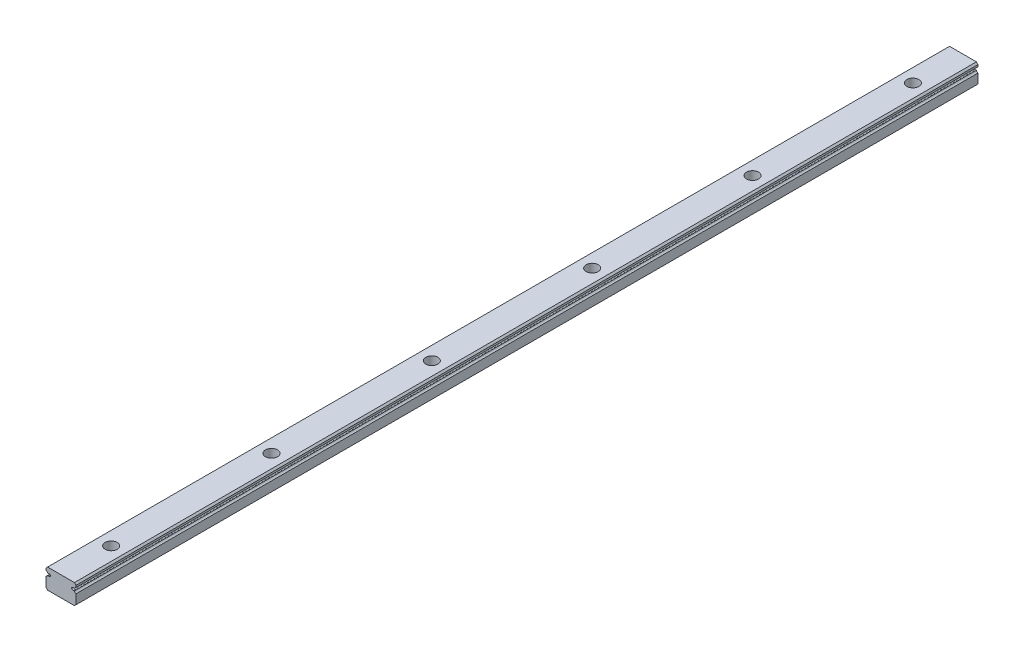
ISO-10303-21;
HEADER;
FILE_DESCRIPTION(('STEP AP214'),'2;1');
FILE_NAME('part.step','',(''),(''),'','','');
FILE_SCHEMA(('AUTOMOTIVE_DESIGN { 1 0 10303 214 1 1 1 1 }'));
ENDSEC;
DATA;
#1=APPLICATION_CONTEXT('core data for automotive mechanical design processes');
#2=APPLICATION_PROTOCOL_DEFINITION('international standard','automotive_design',2000,#1);
#3=PRODUCT_CONTEXT('',#1,'mechanical');
#4=PRODUCT('Part','Part','',(#3));
#5=PRODUCT_RELATED_PRODUCT_CATEGORY('part','',(#4));
#6=PRODUCT_DEFINITION_FORMATION('','',#4);
#7=PRODUCT_DEFINITION_CONTEXT('part definition',#1,'design');
#8=PRODUCT_DEFINITION('design','',#6,#7);
#9=PRODUCT_DEFINITION_SHAPE('','',#8);
#10=(LENGTH_UNIT() NAMED_UNIT(*) SI_UNIT(.MILLI.,.METRE.));
#11=(NAMED_UNIT(*) PLANE_ANGLE_UNIT() SI_UNIT($,.RADIAN.));
#12=(NAMED_UNIT(*) SI_UNIT($,.STERADIAN.) SOLID_ANGLE_UNIT());
#13=UNCERTAINTY_MEASURE_WITH_UNIT(LENGTH_MEASURE(1.E-05),#10,'distance_accuracy_value','');
#14=(GEOMETRIC_REPRESENTATION_CONTEXT(3) GLOBAL_UNCERTAINTY_ASSIGNED_CONTEXT((#13)) GLOBAL_UNIT_ASSIGNED_CONTEXT((#10,
#11,#12)) REPRESENTATION_CONTEXT('',''));
#15=CARTESIAN_POINT('',(0.,0.,0.));
#16=DIRECTION('',(0.,0.,1.));
#17=DIRECTION('',(1.,0.,0.));
#18=AXIS2_PLACEMENT_3D('',#15,#16,#17);
#19=CARTESIAN_POINT('',(0.,2.44399999999999,-450.));
#20=DIRECTION('',(0.,1.,0.));
#21=DIRECTION('',(-1.,0.,0.));
#22=AXIS2_PLACEMENT_3D('',#19,#20,#21);
#23=PLANE('',#22);
#24=DIRECTION('',(-1.,0.,0.));
#25=VECTOR('',#24,1.);
#26=CARTESIAN_POINT('',(0.,2.44399999999999,0.));
#27=LINE('',#26,#25);
#28=CARTESIAN_POINT('',(6.62453106662687,2.444,0.));
#29=VERTEX_POINT('',#28);
#30=CARTESIAN_POINT('',(6.13979157616564,2.444,0.));
#31=VERTEX_POINT('',#30);
#32=EDGE_CURVE('E214',#29,#31,#27,.T.);
#33=ORIENTED_EDGE('',*,*,#32,.T.);
#34=DIRECTION('',(0.,0.,1.));
#35=VECTOR('',#34,1.);
#36=CARTESIAN_POINT('',(6.13979157616564,2.444,-450.));
#37=LINE('',#36,#35);
#38=CARTESIAN_POINT('',(6.13979157616564,2.444,-450.));
#39=VERTEX_POINT('',#38);
#40=EDGE_CURVE('E11',#39,#31,#37,.T.);
#41=ORIENTED_EDGE('',*,*,#40,.F.);
#42=DIRECTION('',(-1.,0.,0.));
#43=VECTOR('',#42,1.);
#44=CARTESIAN_POINT('',(0.,2.44399999999999,-450.));
#45=LINE('',#44,#43);
#46=CARTESIAN_POINT('',(6.62453106662687,2.444,-450.));
#47=VERTEX_POINT('',#46);
#48=EDGE_CURVE('E63',#47,#39,#45,.T.);
#49=ORIENTED_EDGE('',*,*,#48,.F.);
#50=DIRECTION('',(0.,0.,1.));
#51=VECTOR('',#50,1.);
#52=CARTESIAN_POINT('',(6.62453106662687,2.444,-450.));
#53=LINE('',#52,#51);
#54=EDGE_CURVE('E48',#47,#29,#53,.T.);
#55=ORIENTED_EDGE('',*,*,#54,.T.);
#56=EDGE_LOOP('',(#33,#41,#49,#55));
#57=FACE_BOUND('',#56,.T.);
#58=ADVANCED_FACE('F45',(#57),#23,.F.);
#59=CARTESIAN_POINT('',(5.9,1.894,-450.));
#60=DIRECTION('',(0.,0.,1.));
#61=DIRECTION('',(1.,0.,0.));
#62=AXIS2_PLACEMENT_3D('',#59,#60,#61);
#63=CYLINDRICAL_SURFACE('',#62,0.6);
#64=CARTESIAN_POINT('',(5.9,1.894,0.));
#65=DIRECTION('',(0.,0.,1.));
#66=DIRECTION('',(1.,0.,0.));
#67=AXIS2_PLACEMENT_3D('',#64,#65,#66);
#68=CIRCLE('',#67,0.6);
#69=CARTESIAN_POINT('',(6.13979157616564,1.344,0.));
#70=VERTEX_POINT('',#69);
#71=EDGE_CURVE('E260',#70,#31,#68,.F.);
#72=ORIENTED_EDGE('',*,*,#71,.F.);
#73=DIRECTION('',(0.,0.,1.));
#74=VECTOR('',#73,1.);
#75=CARTESIAN_POINT('',(6.13979157616564,1.344,-450.));
#76=LINE('',#75,#74);
#77=CARTESIAN_POINT('',(6.13979157616564,1.344,-450.));
#78=VERTEX_POINT('',#77);
#79=EDGE_CURVE('E54',#78,#70,#76,.T.);
#80=ORIENTED_EDGE('',*,*,#79,.F.);
#81=CARTESIAN_POINT('',(5.9,1.894,-450.));
#82=DIRECTION('',(0.,0.,1.));
#83=DIRECTION('',(1.,0.,0.));
#84=AXIS2_PLACEMENT_3D('',#81,#82,#83);
#85=CIRCLE('',#84,0.6);
#86=EDGE_CURVE('E204',#78,#39,#85,.F.);
#87=ORIENTED_EDGE('',*,*,#86,.T.);
#88=ORIENTED_EDGE('',*,*,#40,.T.);
#89=EDGE_LOOP('',(#72,#80,#87,#88));
#90=FACE_BOUND('',#89,.T.);
#91=ADVANCED_FACE('F318',(#90),#63,.F.);
#92=CARTESIAN_POINT('',(0.,1.34399999999999,-450.));
#93=DIRECTION('',(0.,1.,0.));
#94=DIRECTION('',(-1.,0.,0.));
#95=AXIS2_PLACEMENT_3D('',#92,#93,#94);
#96=PLANE('',#95);
#97=DIRECTION('',(-1.,0.,0.));
#98=VECTOR('',#97,1.);
#99=CARTESIAN_POINT('',(0.,1.34399999999999,0.));
#100=LINE('',#99,#98);
#101=CARTESIAN_POINT('',(6.62453106662687,1.344,0.));
#102=VERTEX_POINT('',#101);
#103=EDGE_CURVE('E192',#102,#70,#100,.T.);
#104=ORIENTED_EDGE('',*,*,#103,.F.);
#105=DIRECTION('',(0.,0.,1.));
#106=VECTOR('',#105,1.);
#107=CARTESIAN_POINT('',(6.62453106662687,1.344,-450.));
#108=LINE('',#107,#106);
#109=CARTESIAN_POINT('',(6.62453106662687,1.344,-450.));
#110=VERTEX_POINT('',#109);
#111=EDGE_CURVE('E188',#110,#102,#108,.T.);
#112=ORIENTED_EDGE('',*,*,#111,.F.);
#113=DIRECTION('',(-1.,0.,0.));
#114=VECTOR('',#113,1.);
#115=CARTESIAN_POINT('',(0.,1.34399999999999,-450.));
#116=LINE('',#115,#114);
#117=EDGE_CURVE('E191',#110,#78,#116,.T.);
#118=ORIENTED_EDGE('',*,*,#117,.T.);
#119=ORIENTED_EDGE('',*,*,#79,.T.);
#120=EDGE_LOOP('',(#104,#112,#118,#119));
#121=FACE_BOUND('',#120,.T.);
#122=ADVANCED_FACE('F190',(#121),#96,.T.);
#123=CARTESIAN_POINT('',(7.9,1.894,-450.));
#124=DIRECTION('',(0.,0.,1.));
#125=DIRECTION('',(1.,0.,0.));
#126=AXIS2_PLACEMENT_3D('',#123,#124,#125);
#127=CYLINDRICAL_SURFACE('',#126,1.389);
#128=CARTESIAN_POINT('',(7.9,1.894,0.));
#129=DIRECTION('',(0.,0.,1.));
#130=DIRECTION('',(1.,0.,0.));
#131=AXIS2_PLACEMENT_3D('',#128,#129,#130);
#132=CIRCLE('',#131,1.389);
#133=CARTESIAN_POINT('',(7.5,0.563841738739334,0.));
#134=VERTEX_POINT('',#133);
#135=EDGE_CURVE('E257',#134,#102,#132,.F.);
#136=ORIENTED_EDGE('',*,*,#135,.F.);
#137=DIRECTION('',(0.,0.,1.));
#138=VECTOR('',#137,1.);
#139=CARTESIAN_POINT('',(7.5,0.563841738739334,-450.));
#140=LINE('',#139,#138);
#141=CARTESIAN_POINT('',(7.5,0.563841738739334,-450.));
#142=VERTEX_POINT('',#141);
#143=EDGE_CURVE('E197',#142,#134,#140,.T.);
#144=ORIENTED_EDGE('',*,*,#143,.F.);
#145=CARTESIAN_POINT('',(7.9,1.894,-450.));
#146=DIRECTION('',(0.,0.,1.));
#147=DIRECTION('',(1.,0.,0.));
#148=AXIS2_PLACEMENT_3D('',#145,#146,#147);
#149=CIRCLE('',#148,1.389);
#150=EDGE_CURVE('E202',#142,#110,#149,.F.);
#151=ORIENTED_EDGE('',*,*,#150,.T.);
#152=ORIENTED_EDGE('',*,*,#111,.T.);
#153=EDGE_LOOP('',(#136,#144,#151,#152));
#154=FACE_BOUND('',#153,.T.);
#155=ADVANCED_FACE('F206',(#154),#127,.F.);
#156=CARTESIAN_POINT('',(7.5,0.,-450.));
#157=DIRECTION('',(1.,0.,0.));
#158=DIRECTION('',(0.,0.,-1.));
#159=AXIS2_PLACEMENT_3D('',#156,#157,#158);
#160=PLANE('',#159);
#161=DIRECTION('',(0.,1.,0.));
#162=VECTOR('',#161,1.);
#163=CARTESIAN_POINT('',(7.5,0.,0.));
#164=LINE('',#163,#162);
#165=CARTESIAN_POINT('',(7.5,-4.2,0.));
#166=VERTEX_POINT('',#165);
#167=EDGE_CURVE('E254',#166,#134,#164,.T.);
#168=ORIENTED_EDGE('',*,*,#167,.F.);
#169=DIRECTION('',(0.,0.,1.));
#170=VECTOR('',#169,1.);
#171=CARTESIAN_POINT('',(7.5,-4.2,-450.));
#172=LINE('',#171,#170);
#173=CARTESIAN_POINT('',(7.5,-4.2,-450.));
#174=VERTEX_POINT('',#173);
#175=EDGE_CURVE('E265',#174,#166,#172,.T.);
#176=ORIENTED_EDGE('',*,*,#175,.F.);
#177=DIRECTION('',(0.,1.,0.));
#178=VECTOR('',#177,1.);
#179=CARTESIAN_POINT('',(7.5,0.,-450.));
#180=LINE('',#179,#178);
#181=EDGE_CURVE('E207',#174,#142,#180,.T.);
#182=ORIENTED_EDGE('',*,*,#181,.T.);
#183=ORIENTED_EDGE('',*,*,#143,.T.);
#184=EDGE_LOOP('',(#168,#176,#182,#183));
#185=FACE_BOUND('',#184,.T.);
#186=ADVANCED_FACE('F331',(#185),#160,.T.);
#187=CARTESIAN_POINT('',(5.85,-5.85,-450.));
#188=DIRECTION('',(0.707106781186547,-0.707106781186547,0.));
#189=DIRECTION('',(0.707106781186548,0.707106781186548,0.));
#190=AXIS2_PLACEMENT_3D('',#187,#188,#189);
#191=PLANE('',#190);
#192=DIRECTION('',(0.707106781186548,0.707106781186548,0.));
#193=VECTOR('',#192,1.);
#194=CARTESIAN_POINT('',(5.85,-5.85,0.));
#195=LINE('',#194,#193);
#196=CARTESIAN_POINT('',(6.7,-5.,0.));
#197=VERTEX_POINT('',#196);
#198=EDGE_CURVE('E251',#197,#166,#195,.T.);
#199=ORIENTED_EDGE('',*,*,#198,.F.);
#200=DIRECTION('',(0.,0.,1.));
#201=VECTOR('',#200,1.);
#202=CARTESIAN_POINT('',(6.7,-5.,-450.));
#203=LINE('',#202,#201);
#204=CARTESIAN_POINT('',(6.7,-5.,-450.));
#205=VERTEX_POINT('',#204);
#206=EDGE_CURVE('E267',#205,#197,#203,.T.);
#207=ORIENTED_EDGE('',*,*,#206,.F.);
#208=DIRECTION('',(0.707106781186548,0.707106781186548,0.));
#209=VECTOR('',#208,1.);
#210=CARTESIAN_POINT('',(5.85,-5.85,-450.));
#211=LINE('',#210,#209);
#212=EDGE_CURVE('E209',#205,#174,#211,.T.);
#213=ORIENTED_EDGE('',*,*,#212,.T.);
#214=ORIENTED_EDGE('',*,*,#175,.T.);
#215=EDGE_LOOP('',(#199,#207,#213,#214));
#216=FACE_BOUND('',#215,.T.);
#217=ADVANCED_FACE('F334',(#216),#191,.T.);
#218=CARTESIAN_POINT('',(0.,-5.,-450.));
#219=DIRECTION('',(0.,1.,0.));
#220=DIRECTION('',(0.,0.,1.));
#221=AXIS2_PLACEMENT_3D('',#218,#219,#220);
#222=PLANE('',#221);
#223=CARTESIAN_POINT('',(0.,-5.,-425.));
#224=DIRECTION('',(0.,1.,0.));
#225=DIRECTION('',(0.,0.,1.));
#226=AXIS2_PLACEMENT_3D('',#223,#224,#225);
#227=CIRCLE('',#226,1.75);
#228=CARTESIAN_POINT('',(0.,-5.,-423.25));
#229=VERTEX_POINT('',#228);
#230=EDGE_CURVE('E529',#229,#229,#227,.T.);
#231=ORIENTED_EDGE('',*,*,#230,.T.);
#232=EDGE_LOOP('',(#231));
#233=FACE_BOUND('',#232,.T.);
#234=CARTESIAN_POINT('',(0.,-5.,-345.));
#235=DIRECTION('',(0.,1.,0.));
#236=DIRECTION('',(0.,0.,1.));
#237=AXIS2_PLACEMENT_3D('',#234,#235,#236);
#238=CIRCLE('',#237,1.75);
#239=CARTESIAN_POINT('',(0.,-5.,-343.25));
#240=VERTEX_POINT('',#239);
#241=EDGE_CURVE('E517',#240,#240,#238,.T.);
#242=ORIENTED_EDGE('',*,*,#241,.T.);
#243=EDGE_LOOP('',(#242));
#244=FACE_BOUND('',#243,.T.);
#245=CARTESIAN_POINT('',(0.,-5.,-265.));
#246=DIRECTION('',(0.,1.,0.));
#247=DIRECTION('',(0.,0.,1.));
#248=AXIS2_PLACEMENT_3D('',#245,#246,#247);
#249=CIRCLE('',#248,1.75);
#250=CARTESIAN_POINT('',(0.,-5.,-263.25));
#251=VERTEX_POINT('',#250);
#252=EDGE_CURVE('E505',#251,#251,#249,.T.);
#253=ORIENTED_EDGE('',*,*,#252,.T.);
#254=EDGE_LOOP('',(#253));
#255=FACE_BOUND('',#254,.T.);
#256=CARTESIAN_POINT('',(0.,-5.,-185.));
#257=DIRECTION('',(0.,1.,0.));
#258=DIRECTION('',(0.,0.,1.));
#259=AXIS2_PLACEMENT_3D('',#256,#257,#258);
#260=CIRCLE('',#259,1.75);
#261=CARTESIAN_POINT('',(0.,-5.,-183.25));
#262=VERTEX_POINT('',#261);
#263=EDGE_CURVE('E493',#262,#262,#260,.T.);
#264=ORIENTED_EDGE('',*,*,#263,.T.);
#265=EDGE_LOOP('',(#264));
#266=FACE_BOUND('',#265,.T.);
#267=CARTESIAN_POINT('',(0.,-5.,-105.));
#268=DIRECTION('',(0.,1.,0.));
#269=DIRECTION('',(0.,0.,1.));
#270=AXIS2_PLACEMENT_3D('',#267,#268,#269);
#271=CIRCLE('',#270,1.75);
#272=CARTESIAN_POINT('',(0.,-5.,-103.25));
#273=VERTEX_POINT('',#272);
#274=EDGE_CURVE('E481',#273,#273,#271,.T.);
#275=ORIENTED_EDGE('',*,*,#274,.T.);
#276=EDGE_LOOP('',(#275));
#277=FACE_BOUND('',#276,.T.);
#278=CARTESIAN_POINT('',(0.,-5.,-25.));
#279=DIRECTION('',(0.,1.,0.));
#280=DIRECTION('',(0.,0.,1.));
#281=AXIS2_PLACEMENT_3D('',#278,#279,#280);
#282=CIRCLE('',#281,1.75);
#283=CARTESIAN_POINT('',(0.,-5.,-23.25));
#284=VERTEX_POINT('',#283);
#285=EDGE_CURVE('E464',#284,#284,#282,.T.);
#286=ORIENTED_EDGE('',*,*,#285,.T.);
#287=EDGE_LOOP('',(#286));
#288=FACE_BOUND('',#287,.T.);
#289=DIRECTION('',(-1.,0.,0.));
#290=VECTOR('',#289,1.);
#291=CARTESIAN_POINT('',(0.,-5.,0.));
#292=LINE('',#291,#290);
#293=CARTESIAN_POINT('',(-6.7,-5.,0.));
#294=VERTEX_POINT('',#293);
#295=EDGE_CURVE('E249',#197,#294,#292,.T.);
#296=ORIENTED_EDGE('',*,*,#295,.T.);
#297=DIRECTION('',(0.,0.,1.));
#298=VECTOR('',#297,1.);
#299=CARTESIAN_POINT('',(-6.7,-5.,-450.));
#300=LINE('',#299,#298);
#301=CARTESIAN_POINT('',(-6.7,-5.,-450.));
#302=VERTEX_POINT('',#301);
#303=EDGE_CURVE('E269',#302,#294,#300,.T.);
#304=ORIENTED_EDGE('',*,*,#303,.F.);
#305=DIRECTION('',(-1.,0.,0.));
#306=VECTOR('',#305,1.);
#307=CARTESIAN_POINT('',(0.,-5.,-450.));
#308=LINE('',#307,#306);
#309=EDGE_CURVE('E423',#205,#302,#308,.T.);
#310=ORIENTED_EDGE('',*,*,#309,.F.);
#311=ORIENTED_EDGE('',*,*,#206,.T.);
#312=EDGE_LOOP('',(#296,#304,#310,#311));
#313=FACE_BOUND('',#312,.T.);
#314=ADVANCED_FACE('F338',(#233,#244,#255,#266,#277,#288,#313),#222,.F.);
#315=CARTESIAN_POINT('',(-5.85,-5.85,-450.));
#316=DIRECTION('',(0.707106781186547,0.707106781186547,0.));
#317=DIRECTION('',(-0.707106781186548,0.707106781186548,0.));
#318=AXIS2_PLACEMENT_3D('',#315,#316,#317);
#319=PLANE('',#318);
#320=DIRECTION('',(-0.707106781186548,0.707106781186548,0.));
#321=VECTOR('',#320,1.);
#322=CARTESIAN_POINT('',(-5.85,-5.85,0.));
#323=LINE('',#322,#321);
#324=CARTESIAN_POINT('',(-7.5,-4.2,0.));
#325=VERTEX_POINT('',#324);
#326=EDGE_CURVE('E247',#294,#325,#323,.T.);
#327=ORIENTED_EDGE('',*,*,#326,.T.);
#328=DIRECTION('',(0.,0.,1.));
#329=VECTOR('',#328,1.);
#330=CARTESIAN_POINT('',(-7.5,-4.2,-450.));
#331=LINE('',#330,#329);
#332=CARTESIAN_POINT('',(-7.5,-4.2,-450.));
#333=VERTEX_POINT('',#332);
#334=EDGE_CURVE('E272',#333,#325,#331,.T.);
#335=ORIENTED_EDGE('',*,*,#334,.F.);
#336=DIRECTION('',(-0.707106781186548,0.707106781186548,0.));
#337=VECTOR('',#336,1.);
#338=CARTESIAN_POINT('',(-5.85,-5.85,-450.));
#339=LINE('',#338,#337);
#340=EDGE_CURVE('E421',#302,#333,#339,.T.);
#341=ORIENTED_EDGE('',*,*,#340,.F.);
#342=ORIENTED_EDGE('',*,*,#303,.T.);
#343=EDGE_LOOP('',(#327,#335,#341,#342));
#344=FACE_BOUND('',#343,.T.);
#345=ADVANCED_FACE('F342',(#344),#319,.F.);
#346=CARTESIAN_POINT('',(-7.5,0.,-450.));
#347=DIRECTION('',(1.,0.,0.));
#348=DIRECTION('',(0.,1.,0.));
#349=AXIS2_PLACEMENT_3D('',#346,#347,#348);
#350=PLANE('',#349);
#351=DIRECTION('',(0.,1.,0.));
#352=VECTOR('',#351,1.);
#353=CARTESIAN_POINT('',(-7.5,0.,0.));
#354=LINE('',#353,#352);
#355=CARTESIAN_POINT('',(-7.5,0.563841738739332,0.));
#356=VERTEX_POINT('',#355);
#357=EDGE_CURVE('E245',#325,#356,#354,.T.);
#358=ORIENTED_EDGE('',*,*,#357,.T.);
#359=DIRECTION('',(0.,0.,1.));
#360=VECTOR('',#359,1.);
#361=CARTESIAN_POINT('',(-7.5,0.563841738739332,-450.));
#362=LINE('',#361,#360);
#363=CARTESIAN_POINT('',(-7.5,0.563841738739332,-450.));
#364=VERTEX_POINT('',#363);
#365=EDGE_CURVE('E275',#364,#356,#362,.T.);
#366=ORIENTED_EDGE('',*,*,#365,.F.);
#367=DIRECTION('',(0.,1.,0.));
#368=VECTOR('',#367,1.);
#369=CARTESIAN_POINT('',(-7.5,0.,-450.));
#370=LINE('',#369,#368);
#371=EDGE_CURVE('E419',#333,#364,#370,.T.);
#372=ORIENTED_EDGE('',*,*,#371,.F.);
#373=ORIENTED_EDGE('',*,*,#334,.T.);
#374=EDGE_LOOP('',(#358,#366,#372,#373));
#375=FACE_BOUND('',#374,.T.);
#376=ADVANCED_FACE('F346',(#375),#350,.F.);
#377=CARTESIAN_POINT('',(-7.9,1.894,-450.));
#378=DIRECTION('',(0.,0.,1.));
#379=DIRECTION('',(1.,0.,0.));
#380=AXIS2_PLACEMENT_3D('',#377,#378,#379);
#381=CYLINDRICAL_SURFACE('',#380,1.389);
#382=CARTESIAN_POINT('',(-7.9,1.894,0.));
#383=DIRECTION('',(0.,0.,1.));
#384=DIRECTION('',(1.,0.,0.));
#385=AXIS2_PLACEMENT_3D('',#382,#383,#384);
#386=CIRCLE('',#385,1.389);
#387=CARTESIAN_POINT('',(-6.62453106662687,1.344,0.));
#388=VERTEX_POINT('',#387);
#389=EDGE_CURVE('E243',#356,#388,#386,.T.);
#390=ORIENTED_EDGE('',*,*,#389,.T.);
#391=DIRECTION('',(0.,0.,1.));
#392=VECTOR('',#391,1.);
#393=CARTESIAN_POINT('',(-6.62453106662687,1.344,-450.));
#394=LINE('',#393,#392);
#395=CARTESIAN_POINT('',(-6.62453106662687,1.344,-450.));
#396=VERTEX_POINT('',#395);
#397=EDGE_CURVE('E278',#396,#388,#394,.T.);
#398=ORIENTED_EDGE('',*,*,#397,.F.);
#399=CARTESIAN_POINT('',(-7.9,1.894,-450.));
#400=DIRECTION('',(0.,0.,1.));
#401=DIRECTION('',(1.,0.,0.));
#402=AXIS2_PLACEMENT_3D('',#399,#400,#401);
#403=CIRCLE('',#402,1.389);
#404=EDGE_CURVE('E417',#364,#396,#403,.T.);
#405=ORIENTED_EDGE('',*,*,#404,.F.);
#406=ORIENTED_EDGE('',*,*,#365,.T.);
#407=EDGE_LOOP('',(#390,#398,#405,#406));
#408=FACE_BOUND('',#407,.T.);
#409=ADVANCED_FACE('F350',(#408),#381,.F.);
#410=CARTESIAN_POINT('',(0.,1.34400000000001,-450.));
#411=DIRECTION('',(0.,-1.,0.));
#412=DIRECTION('',(1.,0.,0.));
#413=AXIS2_PLACEMENT_3D('',#410,#411,#412);
#414=PLANE('',#413);
#415=DIRECTION('',(1.,0.,0.));
#416=VECTOR('',#415,1.);
#417=CARTESIAN_POINT('',(0.,1.34400000000001,0.));
#418=LINE('',#417,#416);
#419=CARTESIAN_POINT('',(-6.13979157616564,1.344,0.));
#420=VERTEX_POINT('',#419);
#421=EDGE_CURVE('E241',#388,#420,#418,.T.);
#422=ORIENTED_EDGE('',*,*,#421,.T.);
#423=DIRECTION('',(0.,0.,1.));
#424=VECTOR('',#423,1.);
#425=CARTESIAN_POINT('',(-6.13979157616564,1.344,-450.));
#426=LINE('',#425,#424);
#427=CARTESIAN_POINT('',(-6.13979157616564,1.344,-450.));
#428=VERTEX_POINT('',#427);
#429=EDGE_CURVE('E281',#428,#420,#426,.T.);
#430=ORIENTED_EDGE('',*,*,#429,.F.);
#431=DIRECTION('',(1.,0.,0.));
#432=VECTOR('',#431,1.);
#433=CARTESIAN_POINT('',(0.,1.34400000000001,-450.));
#434=LINE('',#433,#432);
#435=EDGE_CURVE('E415',#396,#428,#434,.T.);
#436=ORIENTED_EDGE('',*,*,#435,.F.);
#437=ORIENTED_EDGE('',*,*,#397,.T.);
#438=EDGE_LOOP('',(#422,#430,#436,#437));
#439=FACE_BOUND('',#438,.T.);
#440=ADVANCED_FACE('F354',(#439),#414,.F.);
#441=CARTESIAN_POINT('',(-5.9,1.894,-450.));
#442=DIRECTION('',(0.,0.,1.));
#443=DIRECTION('',(1.,0.,0.));
#444=AXIS2_PLACEMENT_3D('',#441,#442,#443);
#445=CYLINDRICAL_SURFACE('',#444,0.6);
#446=CARTESIAN_POINT('',(-5.9,1.894,0.));
#447=DIRECTION('',(0.,0.,1.));
#448=DIRECTION('',(1.,0.,0.));
#449=AXIS2_PLACEMENT_3D('',#446,#447,#448);
#450=CIRCLE('',#449,0.6);
#451=CARTESIAN_POINT('',(-6.13979157616564,2.444,0.));
#452=VERTEX_POINT('',#451);
#453=EDGE_CURVE('E238',#420,#452,#450,.T.);
#454=ORIENTED_EDGE('',*,*,#453,.T.);
#455=DIRECTION('',(0.,0.,1.));
#456=VECTOR('',#455,1.);
#457=CARTESIAN_POINT('',(-6.13979157616564,2.444,-450.));
#458=LINE('',#457,#456);
#459=CARTESIAN_POINT('',(-6.13979157616564,2.444,-450.));
#460=VERTEX_POINT('',#459);
#461=EDGE_CURVE('E284',#460,#452,#458,.T.);
#462=ORIENTED_EDGE('',*,*,#461,.F.);
#463=CARTESIAN_POINT('',(-5.9,1.894,-450.));
#464=DIRECTION('',(0.,0.,1.));
#465=DIRECTION('',(1.,0.,0.));
#466=AXIS2_PLACEMENT_3D('',#463,#464,#465);
#467=CIRCLE('',#466,0.6);
#468=EDGE_CURVE('E413',#428,#460,#467,.T.);
#469=ORIENTED_EDGE('',*,*,#468,.F.);
#470=ORIENTED_EDGE('',*,*,#429,.T.);
#471=EDGE_LOOP('',(#454,#462,#469,#470));
#472=FACE_BOUND('',#471,.T.);
#473=ADVANCED_FACE('F358',(#472),#445,.F.);
#474=CARTESIAN_POINT('',(0.,2.44400000000001,-450.));
#475=DIRECTION('',(0.,-1.,0.));
#476=DIRECTION('',(1.,0.,0.));
#477=AXIS2_PLACEMENT_3D('',#474,#475,#476);
#478=PLANE('',#477);
#479=DIRECTION('',(1.,0.,0.));
#480=VECTOR('',#479,1.);
#481=CARTESIAN_POINT('',(0.,2.44400000000001,0.));
#482=LINE('',#481,#480);
#483=CARTESIAN_POINT('',(-6.62453106662687,2.444,0.));
#484=VERTEX_POINT('',#483);
#485=EDGE_CURVE('E235',#484,#452,#482,.T.);
#486=ORIENTED_EDGE('',*,*,#485,.F.);
#487=DIRECTION('',(0.,0.,1.));
#488=VECTOR('',#487,1.);
#489=CARTESIAN_POINT('',(-6.62453106662687,2.444,-450.));
#490=LINE('',#489,#488);
#491=CARTESIAN_POINT('',(-6.62453106662687,2.444,-450.));
#492=VERTEX_POINT('',#491);
#493=EDGE_CURVE('E286',#492,#484,#490,.T.);
#494=ORIENTED_EDGE('',*,*,#493,.F.);
#495=DIRECTION('',(1.,0.,0.));
#496=VECTOR('',#495,1.);
#497=CARTESIAN_POINT('',(0.,2.44400000000001,-450.));
#498=LINE('',#497,#496);
#499=EDGE_CURVE('E410',#492,#460,#498,.T.);
#500=ORIENTED_EDGE('',*,*,#499,.T.);
#501=ORIENTED_EDGE('',*,*,#461,.T.);
#502=EDGE_LOOP('',(#486,#494,#500,#501));
#503=FACE_BOUND('',#502,.T.);
#504=ADVANCED_FACE('F362',(#503),#478,.T.);
#505=CARTESIAN_POINT('',(-7.9,1.894,-450.));
#506=DIRECTION('',(0.,0.,1.));
#507=DIRECTION('',(1.,0.,0.));
#508=AXIS2_PLACEMENT_3D('',#505,#506,#507);
#509=CYLINDRICAL_SURFACE('',#508,1.389);
#510=CARTESIAN_POINT('',(-7.9,1.894,0.));
#511=DIRECTION('',(0.,0.,1.));
#512=DIRECTION('',(1.,0.,0.));
#513=AXIS2_PLACEMENT_3D('',#510,#511,#512);
#514=CIRCLE('',#513,1.389);
#515=CARTESIAN_POINT('',(-7.5,3.22415826126066,0.));
#516=VERTEX_POINT('',#515);
#517=EDGE_CURVE('E233',#484,#516,#514,.T.);
#518=ORIENTED_EDGE('',*,*,#517,.T.);
#519=DIRECTION('',(0.,0.,1.));
#520=VECTOR('',#519,1.);
#521=CARTESIAN_POINT('',(-7.5,3.22415826126066,-450.));
#522=LINE('',#521,#520);
#523=CARTESIAN_POINT('',(-7.5,3.22415826126066,-450.));
#524=VERTEX_POINT('',#523);
#525=EDGE_CURVE('E288',#524,#516,#522,.T.);
#526=ORIENTED_EDGE('',*,*,#525,.F.);
#527=CARTESIAN_POINT('',(-7.9,1.894,-450.));
#528=DIRECTION('',(0.,0.,1.));
#529=DIRECTION('',(1.,0.,0.));
#530=AXIS2_PLACEMENT_3D('',#527,#528,#529);
#531=CIRCLE('',#530,1.389);
#532=EDGE_CURVE('E408',#492,#524,#531,.T.);
#533=ORIENTED_EDGE('',*,*,#532,.F.);
#534=ORIENTED_EDGE('',*,*,#493,.T.);
#535=EDGE_LOOP('',(#518,#526,#533,#534));
#536=FACE_BOUND('',#535,.T.);
#537=ADVANCED_FACE('F366',(#536),#509,.F.);
#538=CARTESIAN_POINT('',(-7.5,0.,-450.));
#539=DIRECTION('',(1.,0.,0.));
#540=DIRECTION('',(0.,1.,0.));
#541=AXIS2_PLACEMENT_3D('',#538,#539,#540);
#542=PLANE('',#541);
#543=DIRECTION('',(0.,1.,0.));
#544=VECTOR('',#543,1.);
#545=CARTESIAN_POINT('',(-7.5,0.,0.));
#546=LINE('',#545,#544);
#547=CARTESIAN_POINT('',(-7.5,4.2,0.));
#548=VERTEX_POINT('',#547);
#549=EDGE_CURVE('E231',#516,#548,#546,.T.);
#550=ORIENTED_EDGE('',*,*,#549,.T.);
#551=DIRECTION('',(0.,0.,1.));
#552=VECTOR('',#551,1.);
#553=CARTESIAN_POINT('',(-7.5,4.2,-450.));
#554=LINE('',#553,#552);
#555=CARTESIAN_POINT('',(-7.5,4.2,-450.));
#556=VERTEX_POINT('',#555);
#557=EDGE_CURVE('E291',#556,#548,#554,.T.);
#558=ORIENTED_EDGE('',*,*,#557,.F.);
#559=DIRECTION('',(0.,1.,0.));
#560=VECTOR('',#559,1.);
#561=CARTESIAN_POINT('',(-7.5,0.,-450.));
#562=LINE('',#561,#560);
#563=EDGE_CURVE('E406',#524,#556,#562,.T.);
#564=ORIENTED_EDGE('',*,*,#563,.F.);
#565=ORIENTED_EDGE('',*,*,#525,.T.);
#566=EDGE_LOOP('',(#550,#558,#564,#565));
#567=FACE_BOUND('',#566,.T.);
#568=ADVANCED_FACE('F370',(#567),#542,.F.);
#569=CARTESIAN_POINT('',(-5.85,5.85,-450.));
#570=DIRECTION('',(0.707106781186547,-0.707106781186547,0.));
#571=DIRECTION('',(0.707106781186548,0.707106781186548,0.));
#572=AXIS2_PLACEMENT_3D('',#569,#570,#571);
#573=PLANE('',#572);
#574=DIRECTION('',(0.707106781186548,0.707106781186548,0.));
#575=VECTOR('',#574,1.);
#576=CARTESIAN_POINT('',(-5.85,5.85,0.));
#577=LINE('',#576,#575);
#578=CARTESIAN_POINT('',(-6.7,5.,0.));
#579=VERTEX_POINT('',#578);
#580=EDGE_CURVE('E229',#548,#579,#577,.T.);
#581=ORIENTED_EDGE('',*,*,#580,.T.);
#582=DIRECTION('',(0.,0.,1.));
#583=VECTOR('',#582,1.);
#584=CARTESIAN_POINT('',(-6.7,5.,-450.));
#585=LINE('',#584,#583);
#586=CARTESIAN_POINT('',(-6.7,5.,-450.));
#587=VERTEX_POINT('',#586);
#588=EDGE_CURVE('E294',#587,#579,#585,.T.);
#589=ORIENTED_EDGE('',*,*,#588,.F.);
#590=DIRECTION('',(0.707106781186548,0.707106781186548,0.));
#591=VECTOR('',#590,1.);
#592=CARTESIAN_POINT('',(-5.85,5.85,-450.));
#593=LINE('',#592,#591);
#594=EDGE_CURVE('E404',#556,#587,#593,.T.);
#595=ORIENTED_EDGE('',*,*,#594,.F.);
#596=ORIENTED_EDGE('',*,*,#557,.T.);
#597=EDGE_LOOP('',(#581,#589,#595,#596));
#598=FACE_BOUND('',#597,.T.);
#599=ADVANCED_FACE('F374',(#598),#573,.F.);
#600=CARTESIAN_POINT('',(0.,5.,-450.));
#601=DIRECTION('',(0.,-1.,0.));
#602=DIRECTION('',(0.,0.,-1.));
#603=AXIS2_PLACEMENT_3D('',#600,#601,#602);
#604=PLANE('',#603);
#605=CARTESIAN_POINT('',(0.,5.,-425.));
#606=DIRECTION('',(0.,1.,0.));
#607=DIRECTION('',(0.,0.,1.));
#608=AXIS2_PLACEMENT_3D('',#605,#606,#607);
#609=CIRCLE('',#608,3.);
#610=CARTESIAN_POINT('',(0.,5.,-422.));
#611=VERTEX_POINT('',#610);
#612=EDGE_CURVE('E526',#611,#611,#609,.T.);
#613=ORIENTED_EDGE('',*,*,#612,.F.);
#614=EDGE_LOOP('',(#613));
#615=FACE_BOUND('',#614,.T.);
#616=CARTESIAN_POINT('',(0.,5.,-345.));
#617=DIRECTION('',(0.,1.,0.));
#618=DIRECTION('',(0.,0.,1.));
#619=AXIS2_PLACEMENT_3D('',#616,#617,#618);
#620=CIRCLE('',#619,3.);
#621=CARTESIAN_POINT('',(0.,5.,-342.));
#622=VERTEX_POINT('',#621);
#623=EDGE_CURVE('E514',#622,#622,#620,.T.);
#624=ORIENTED_EDGE('',*,*,#623,.F.);
#625=EDGE_LOOP('',(#624));
#626=FACE_BOUND('',#625,.T.);
#627=CARTESIAN_POINT('',(0.,5.,-265.));
#628=DIRECTION('',(0.,1.,0.));
#629=DIRECTION('',(0.,0.,1.));
#630=AXIS2_PLACEMENT_3D('',#627,#628,#629);
#631=CIRCLE('',#630,3.);
#632=CARTESIAN_POINT('',(0.,5.,-262.));
#633=VERTEX_POINT('',#632);
#634=EDGE_CURVE('E502',#633,#633,#631,.T.);
#635=ORIENTED_EDGE('',*,*,#634,.F.);
#636=EDGE_LOOP('',(#635));
#637=FACE_BOUND('',#636,.T.);
#638=CARTESIAN_POINT('',(0.,5.,-185.));
#639=DIRECTION('',(0.,1.,0.));
#640=DIRECTION('',(0.,0.,1.));
#641=AXIS2_PLACEMENT_3D('',#638,#639,#640);
#642=CIRCLE('',#641,3.);
#643=CARTESIAN_POINT('',(0.,5.,-182.));
#644=VERTEX_POINT('',#643);
#645=EDGE_CURVE('E490',#644,#644,#642,.T.);
#646=ORIENTED_EDGE('',*,*,#645,.F.);
#647=EDGE_LOOP('',(#646));
#648=FACE_BOUND('',#647,.T.);
#649=CARTESIAN_POINT('',(0.,5.,-105.));
#650=DIRECTION('',(0.,1.,0.));
#651=DIRECTION('',(0.,0.,1.));
#652=AXIS2_PLACEMENT_3D('',#649,#650,#651);
#653=CIRCLE('',#652,3.);
#654=CARTESIAN_POINT('',(0.,5.,-102.));
#655=VERTEX_POINT('',#654);
#656=EDGE_CURVE('E478',#655,#655,#653,.T.);
#657=ORIENTED_EDGE('',*,*,#656,.F.);
#658=EDGE_LOOP('',(#657));
#659=FACE_BOUND('',#658,.T.);
#660=CARTESIAN_POINT('',(0.,5.,-25.));
#661=DIRECTION('',(0.,1.,0.));
#662=DIRECTION('',(0.,0.,1.));
#663=AXIS2_PLACEMENT_3D('',#660,#661,#662);
#664=CIRCLE('',#663,3.);
#665=CARTESIAN_POINT('',(0.,5.,-22.));
#666=VERTEX_POINT('',#665);
#667=EDGE_CURVE('E461',#666,#666,#664,.T.);
#668=ORIENTED_EDGE('',*,*,#667,.F.);
#669=EDGE_LOOP('',(#668));
#670=FACE_BOUND('',#669,.T.);
#671=DIRECTION('',(1.,0.,0.));
#672=VECTOR('',#671,1.);
#673=CARTESIAN_POINT('',(0.,5.,0.));
#674=LINE('',#673,#672);
#675=CARTESIAN_POINT('',(6.7,5.,0.));
#676=VERTEX_POINT('',#675);
#677=EDGE_CURVE('E226',#579,#676,#674,.T.);
#678=ORIENTED_EDGE('',*,*,#677,.T.);
#679=DIRECTION('',(0.,0.,1.));
#680=VECTOR('',#679,1.);
#681=CARTESIAN_POINT('',(6.7,5.,-450.));
#682=LINE('',#681,#680);
#683=CARTESIAN_POINT('',(6.7,5.,-450.));
#684=VERTEX_POINT('',#683);
#685=EDGE_CURVE('E297',#684,#676,#682,.T.);
#686=ORIENTED_EDGE('',*,*,#685,.F.);
#687=DIRECTION('',(1.,0.,0.));
#688=VECTOR('',#687,1.);
#689=CARTESIAN_POINT('',(0.,5.,-450.));
#690=LINE('',#689,#688);
#691=EDGE_CURVE('E398',#587,#684,#690,.T.);
#692=ORIENTED_EDGE('',*,*,#691,.F.);
#693=ORIENTED_EDGE('',*,*,#588,.T.);
#694=EDGE_LOOP('',(#678,#686,#692,#693));
#695=FACE_BOUND('',#694,.T.);
#696=ADVANCED_FACE('F378',(#615,#626,#637,#648,#659,#670,#695),#604,.F.);
#697=CARTESIAN_POINT('',(5.85,5.85,-450.));
#698=DIRECTION('',(0.707106781186547,0.707106781186547,0.));
#699=DIRECTION('',(-0.707106781186548,0.707106781186548,0.));
#700=AXIS2_PLACEMENT_3D('',#697,#698,#699);
#701=PLANE('',#700);
#702=DIRECTION('',(-0.707106781186548,0.707106781186548,0.));
#703=VECTOR('',#702,1.);
#704=CARTESIAN_POINT('',(5.85,5.85,0.));
#705=LINE('',#704,#703);
#706=CARTESIAN_POINT('',(7.5,4.2,0.));
#707=VERTEX_POINT('',#706);
#708=EDGE_CURVE('E223',#707,#676,#705,.T.);
#709=ORIENTED_EDGE('',*,*,#708,.F.);
#710=DIRECTION('',(0.,0.,1.));
#711=VECTOR('',#710,1.);
#712=CARTESIAN_POINT('',(7.5,4.2,-450.));
#713=LINE('',#712,#711);
#714=CARTESIAN_POINT('',(7.5,4.2,-450.));
#715=VERTEX_POINT('',#714);
#716=EDGE_CURVE('E299',#715,#707,#713,.T.);
#717=ORIENTED_EDGE('',*,*,#716,.F.);
#718=DIRECTION('',(-0.707106781186548,0.707106781186548,0.));
#719=VECTOR('',#718,1.);
#720=CARTESIAN_POINT('',(5.85,5.85,-450.));
#721=LINE('',#720,#719);
#722=EDGE_CURVE('E395',#715,#684,#721,.T.);
#723=ORIENTED_EDGE('',*,*,#722,.T.);
#724=ORIENTED_EDGE('',*,*,#685,.T.);
#725=EDGE_LOOP('',(#709,#717,#723,#724));
#726=FACE_BOUND('',#725,.T.);
#727=ADVANCED_FACE('F314',(#726),#701,.T.);
#728=CARTESIAN_POINT('',(7.49999999999999,0.,-450.));
#729=DIRECTION('',(1.,0.,0.));
#730=DIRECTION('',(0.,1.,0.));
#731=AXIS2_PLACEMENT_3D('',#728,#729,#730);
#732=PLANE('',#731);
#733=DIRECTION('',(0.,1.,0.));
#734=VECTOR('',#733,1.);
#735=CARTESIAN_POINT('',(7.49999999999999,0.,0.));
#736=LINE('',#735,#734);
#737=CARTESIAN_POINT('',(7.5,3.22415826126067,0.));
#738=VERTEX_POINT('',#737);
#739=EDGE_CURVE('E220',#738,#707,#736,.T.);
#740=ORIENTED_EDGE('',*,*,#739,.F.);
#741=DIRECTION('',(0.,0.,1.));
#742=VECTOR('',#741,1.);
#743=CARTESIAN_POINT('',(7.5,3.22415826126067,-450.));
#744=LINE('',#743,#742);
#745=CARTESIAN_POINT('',(7.5,3.22415826126067,-450.));
#746=VERTEX_POINT('',#745);
#747=EDGE_CURVE('E300',#746,#738,#744,.T.);
#748=ORIENTED_EDGE('',*,*,#747,.F.);
#749=DIRECTION('',(0.,1.,0.));
#750=VECTOR('',#749,1.);
#751=CARTESIAN_POINT('',(7.49999999999999,0.,-450.));
#752=LINE('',#751,#750);
#753=EDGE_CURVE('E394',#746,#715,#752,.T.);
#754=ORIENTED_EDGE('',*,*,#753,.T.);
#755=ORIENTED_EDGE('',*,*,#716,.T.);
#756=EDGE_LOOP('',(#740,#748,#754,#755));
#757=FACE_BOUND('',#756,.T.);
#758=ADVANCED_FACE('F308',(#757),#732,.T.);
#759=CARTESIAN_POINT('',(7.9,1.894,-450.));
#760=DIRECTION('',(0.,0.,1.));
#761=DIRECTION('',(1.,0.,0.));
#762=AXIS2_PLACEMENT_3D('',#759,#760,#761);
#763=CYLINDRICAL_SURFACE('',#762,1.389);
#764=CARTESIAN_POINT('',(7.9,1.894,0.));
#765=DIRECTION('',(0.,0.,1.));
#766=DIRECTION('',(1.,0.,0.));
#767=AXIS2_PLACEMENT_3D('',#764,#765,#766);
#768=CIRCLE('',#767,1.389);
#769=EDGE_CURVE('E216',#29,#738,#768,.F.);
#770=ORIENTED_EDGE('',*,*,#769,.F.);
#771=ORIENTED_EDGE('',*,*,#54,.F.);
#772=CARTESIAN_POINT('',(7.9,1.894,-450.));
#773=DIRECTION('',(0.,0.,1.));
#774=DIRECTION('',(1.,0.,0.));
#775=AXIS2_PLACEMENT_3D('',#772,#773,#774);
#776=CIRCLE('',#775,1.389);
#777=EDGE_CURVE('E396',#47,#746,#776,.F.);
#778=ORIENTED_EDGE('',*,*,#777,.T.);
#779=ORIENTED_EDGE('',*,*,#747,.T.);
#780=EDGE_LOOP('',(#770,#771,#778,#779));
#781=FACE_BOUND('',#780,.T.);
#782=ADVANCED_FACE('F306',(#781),#763,.F.);
#783=CARTESIAN_POINT('',(0.,0.,-450.));
#784=DIRECTION('',(0.,0.,1.));
#785=DIRECTION('',(1.,0.,0.));
#786=AXIS2_PLACEMENT_3D('',#783,#784,#785);
#787=PLANE('',#786);
#788=ORIENTED_EDGE('',*,*,#48,.T.);
#789=ORIENTED_EDGE('',*,*,#86,.F.);
#790=ORIENTED_EDGE('',*,*,#117,.F.);
#791=ORIENTED_EDGE('',*,*,#150,.F.);
#792=ORIENTED_EDGE('',*,*,#181,.F.);
#793=ORIENTED_EDGE('',*,*,#212,.F.);
#794=ORIENTED_EDGE('',*,*,#309,.T.);
#795=ORIENTED_EDGE('',*,*,#340,.T.);
#796=ORIENTED_EDGE('',*,*,#371,.T.);
#797=ORIENTED_EDGE('',*,*,#404,.T.);
#798=ORIENTED_EDGE('',*,*,#435,.T.);
#799=ORIENTED_EDGE('',*,*,#468,.T.);
#800=ORIENTED_EDGE('',*,*,#499,.F.);
#801=ORIENTED_EDGE('',*,*,#532,.T.);
#802=ORIENTED_EDGE('',*,*,#563,.T.);
#803=ORIENTED_EDGE('',*,*,#594,.T.);
#804=ORIENTED_EDGE('',*,*,#691,.T.);
#805=ORIENTED_EDGE('',*,*,#722,.F.);
#806=ORIENTED_EDGE('',*,*,#753,.F.);
#807=ORIENTED_EDGE('',*,*,#777,.F.);
#808=EDGE_LOOP('',(#788,#789,#790,#791,#792,#793,#794,#795,#796,#797,#798,#799,#800,#801,#802,
#803,#804,#805,#806,#807));
#809=FACE_BOUND('',#808,.T.);
#810=ADVANCED_FACE('F200',(#809),#787,.F.);
#811=CARTESIAN_POINT('',(0.,0.,0.));
#812=DIRECTION('',(0.,0.,1.));
#813=DIRECTION('',(1.,0.,0.));
#814=AXIS2_PLACEMENT_3D('',#811,#812,#813);
#815=PLANE('',#814);
#816=ORIENTED_EDGE('',*,*,#32,.F.);
#817=ORIENTED_EDGE('',*,*,#769,.T.);
#818=ORIENTED_EDGE('',*,*,#739,.T.);
#819=ORIENTED_EDGE('',*,*,#708,.T.);
#820=ORIENTED_EDGE('',*,*,#677,.F.);
#821=ORIENTED_EDGE('',*,*,#580,.F.);
#822=ORIENTED_EDGE('',*,*,#549,.F.);
#823=ORIENTED_EDGE('',*,*,#517,.F.);
#824=ORIENTED_EDGE('',*,*,#485,.T.);
#825=ORIENTED_EDGE('',*,*,#453,.F.);
#826=ORIENTED_EDGE('',*,*,#421,.F.);
#827=ORIENTED_EDGE('',*,*,#389,.F.);
#828=ORIENTED_EDGE('',*,*,#357,.F.);
#829=ORIENTED_EDGE('',*,*,#326,.F.);
#830=ORIENTED_EDGE('',*,*,#295,.F.);
#831=ORIENTED_EDGE('',*,*,#198,.T.);
#832=ORIENTED_EDGE('',*,*,#167,.T.);
#833=ORIENTED_EDGE('',*,*,#135,.T.);
#834=ORIENTED_EDGE('',*,*,#103,.T.);
#835=ORIENTED_EDGE('',*,*,#71,.T.);
#836=EDGE_LOOP('',(#816,#817,#818,#819,#820,#821,#822,#823,#824,#825,#826,#827,#828,#829,#830,
#831,#832,#833,#834,#835));
#837=FACE_BOUND('',#836,.T.);
#838=ADVANCED_FACE('F305',(#837),#815,.T.);
#839=CARTESIAN_POINT('',(0.,0.5,-25.));
#840=DIRECTION('',(0.,1.,0.));
#841=DIRECTION('',(0.,0.,1.));
#842=AXIS2_PLACEMENT_3D('',#839,#840,#841);
#843=CYLINDRICAL_SURFACE('',#842,3.);
#844=CARTESIAN_POINT('',(0.,0.5,-25.));
#845=DIRECTION('',(0.,1.,0.));
#846=DIRECTION('',(0.,0.,1.));
#847=AXIS2_PLACEMENT_3D('',#844,#845,#846);
#848=CIRCLE('',#847,3.);
#849=CARTESIAN_POINT('',(0.,0.5,-22.));
#850=VERTEX_POINT('',#849);
#851=EDGE_CURVE('E217',#850,#850,#848,.T.);
#852=ORIENTED_EDGE('',*,*,#851,.F.);
#853=EDGE_LOOP('',(#852));
#854=FACE_BOUND('',#853,.T.);
#855=ORIENTED_EDGE('',*,*,#667,.T.);
#856=EDGE_LOOP('',(#855));
#857=FACE_BOUND('',#856,.T.);
#858=ADVANCED_FACE('F563',(#854,#857),#843,.F.);
#859=CARTESIAN_POINT('',(0.,0.5,-25.));
#860=DIRECTION('',(0.,1.,0.));
#861=DIRECTION('',(0.,0.,1.));
#862=AXIS2_PLACEMENT_3D('',#859,#860,#861);
#863=PLANE('',#862);
#864=CARTESIAN_POINT('',(0.,0.5,-25.));
#865=DIRECTION('',(0.,1.,0.));
#866=DIRECTION('',(0.,0.,1.));
#867=AXIS2_PLACEMENT_3D('',#864,#865,#866);
#868=CIRCLE('',#867,1.75);
#869=CARTESIAN_POINT('',(0.,0.5,-23.25));
#870=VERTEX_POINT('',#869);
#871=EDGE_CURVE('E467',#870,#870,#868,.T.);
#872=ORIENTED_EDGE('',*,*,#871,.F.);
#873=EDGE_LOOP('',(#872));
#874=FACE_BOUND('',#873,.T.);
#875=ORIENTED_EDGE('',*,*,#851,.T.);
#876=EDGE_LOOP('',(#875));
#877=FACE_BOUND('',#876,.T.);
#878=ADVANCED_FACE('F565',(#874,#877),#863,.T.);
#879=CARTESIAN_POINT('',(0.,-5.,-25.));
#880=DIRECTION('',(0.,1.,0.));
#881=DIRECTION('',(0.,0.,1.));
#882=AXIS2_PLACEMENT_3D('',#879,#880,#881);
#883=CYLINDRICAL_SURFACE('',#882,1.75);
#884=ORIENTED_EDGE('',*,*,#285,.F.);
#885=EDGE_LOOP('',(#884));
#886=FACE_BOUND('',#885,.T.);
#887=ORIENTED_EDGE('',*,*,#871,.T.);
#888=EDGE_LOOP('',(#887));
#889=FACE_BOUND('',#888,.T.);
#890=ADVANCED_FACE('F572',(#886,#889),#883,.F.);
#891=CARTESIAN_POINT('',(0.,0.5,-105.));
#892=DIRECTION('',(0.,1.,0.));
#893=DIRECTION('',(0.,0.,1.));
#894=AXIS2_PLACEMENT_3D('',#891,#892,#893);
#895=CYLINDRICAL_SURFACE('',#894,3.);
#896=CARTESIAN_POINT('',(0.,0.5,-105.));
#897=DIRECTION('',(0.,1.,0.));
#898=DIRECTION('',(0.,0.,1.));
#899=AXIS2_PLACEMENT_3D('',#896,#897,#898);
#900=CIRCLE('',#899,3.);
#901=CARTESIAN_POINT('',(0.,0.5,-102.));
#902=VERTEX_POINT('',#901);
#903=EDGE_CURVE('E470',#902,#902,#900,.T.);
#904=ORIENTED_EDGE('',*,*,#903,.F.);
#905=EDGE_LOOP('',(#904));
#906=FACE_BOUND('',#905,.T.);
#907=ORIENTED_EDGE('',*,*,#656,.T.);
#908=EDGE_LOOP('',(#907));
#909=FACE_BOUND('',#908,.T.);
#910=ADVANCED_FACE('F579',(#906,#909),#895,.F.);
#911=CARTESIAN_POINT('',(0.,0.5,-105.));
#912=DIRECTION('',(0.,1.,0.));
#913=DIRECTION('',(0.,0.,1.));
#914=AXIS2_PLACEMENT_3D('',#911,#912,#913);
#915=PLANE('',#914);
#916=CARTESIAN_POINT('',(0.,0.5,-105.));
#917=DIRECTION('',(0.,1.,0.));
#918=DIRECTION('',(0.,0.,1.));
#919=AXIS2_PLACEMENT_3D('',#916,#917,#918);
#920=CIRCLE('',#919,1.75);
#921=CARTESIAN_POINT('',(0.,0.5,-103.25));
#922=VERTEX_POINT('',#921);
#923=EDGE_CURVE('E475',#922,#922,#920,.T.);
#924=ORIENTED_EDGE('',*,*,#923,.F.);
#925=EDGE_LOOP('',(#924));
#926=FACE_BOUND('',#925,.T.);
#927=ORIENTED_EDGE('',*,*,#903,.T.);
#928=EDGE_LOOP('',(#927));
#929=FACE_BOUND('',#928,.T.);
#930=ADVANCED_FACE('F583',(#926,#929),#915,.T.);
#931=CARTESIAN_POINT('',(0.,-5.,-105.));
#932=DIRECTION('',(0.,1.,0.));
#933=DIRECTION('',(0.,0.,1.));
#934=AXIS2_PLACEMENT_3D('',#931,#932,#933);
#935=CYLINDRICAL_SURFACE('',#934,1.75);
#936=ORIENTED_EDGE('',*,*,#274,.F.);
#937=EDGE_LOOP('',(#936));
#938=FACE_BOUND('',#937,.T.);
#939=ORIENTED_EDGE('',*,*,#923,.T.);
#940=EDGE_LOOP('',(#939));
#941=FACE_BOUND('',#940,.T.);
#942=ADVANCED_FACE('F587',(#938,#941),#935,.F.);
#943=CARTESIAN_POINT('',(0.,0.5,-185.));
#944=DIRECTION('',(0.,1.,0.));
#945=DIRECTION('',(0.,0.,1.));
#946=AXIS2_PLACEMENT_3D('',#943,#944,#945);
#947=CYLINDRICAL_SURFACE('',#946,3.);
#948=CARTESIAN_POINT('',(0.,0.5,-185.));
#949=DIRECTION('',(0.,1.,0.));
#950=DIRECTION('',(0.,0.,1.));
#951=AXIS2_PLACEMENT_3D('',#948,#949,#950);
#952=CIRCLE('',#951,3.);
#953=CARTESIAN_POINT('',(0.,0.5,-182.));
#954=VERTEX_POINT('',#953);
#955=EDGE_CURVE('E484',#954,#954,#952,.T.);
#956=ORIENTED_EDGE('',*,*,#955,.F.);
#957=EDGE_LOOP('',(#956));
#958=FACE_BOUND('',#957,.T.);
#959=ORIENTED_EDGE('',*,*,#645,.T.);
#960=EDGE_LOOP('',(#959));
#961=FACE_BOUND('',#960,.T.);
#962=ADVANCED_FACE('F591',(#958,#961),#947,.F.);
#963=CARTESIAN_POINT('',(0.,0.5,-185.));
#964=DIRECTION('',(0.,1.,0.));
#965=DIRECTION('',(0.,0.,1.));
#966=AXIS2_PLACEMENT_3D('',#963,#964,#965);
#967=PLANE('',#966);
#968=CARTESIAN_POINT('',(0.,0.5,-185.));
#969=DIRECTION('',(0.,1.,0.));
#970=DIRECTION('',(0.,0.,1.));
#971=AXIS2_PLACEMENT_3D('',#968,#969,#970);
#972=CIRCLE('',#971,1.75);
#973=CARTESIAN_POINT('',(0.,0.5,-183.25));
#974=VERTEX_POINT('',#973);
#975=EDGE_CURVE('E487',#974,#974,#972,.T.);
#976=ORIENTED_EDGE('',*,*,#975,.F.);
#977=EDGE_LOOP('',(#976));
#978=FACE_BOUND('',#977,.T.);
#979=ORIENTED_EDGE('',*,*,#955,.T.);
#980=EDGE_LOOP('',(#979));
#981=FACE_BOUND('',#980,.T.);
#982=ADVANCED_FACE('F595',(#978,#981),#967,.T.);
#983=CARTESIAN_POINT('',(0.,-5.,-185.));
#984=DIRECTION('',(0.,1.,0.));
#985=DIRECTION('',(0.,0.,1.));
#986=AXIS2_PLACEMENT_3D('',#983,#984,#985);
#987=CYLINDRICAL_SURFACE('',#986,1.75);
#988=ORIENTED_EDGE('',*,*,#263,.F.);
#989=EDGE_LOOP('',(#988));
#990=FACE_BOUND('',#989,.T.);
#991=ORIENTED_EDGE('',*,*,#975,.T.);
#992=EDGE_LOOP('',(#991));
#993=FACE_BOUND('',#992,.T.);
#994=ADVANCED_FACE('F599',(#990,#993),#987,.F.);
#995=CARTESIAN_POINT('',(0.,0.5,-265.));
#996=DIRECTION('',(0.,1.,0.));
#997=DIRECTION('',(0.,0.,1.));
#998=AXIS2_PLACEMENT_3D('',#995,#996,#997);
#999=CYLINDRICAL_SURFACE('',#998,3.);
#1000=CARTESIAN_POINT('',(0.,0.5,-265.));
#1001=DIRECTION('',(0.,1.,0.));
#1002=DIRECTION('',(0.,0.,1.));
#1003=AXIS2_PLACEMENT_3D('',#1000,#1001,#1002);
#1004=CIRCLE('',#1003,3.);
#1005=CARTESIAN_POINT('',(0.,0.5,-262.));
#1006=VERTEX_POINT('',#1005);
#1007=EDGE_CURVE('E496',#1006,#1006,#1004,.T.);
#1008=ORIENTED_EDGE('',*,*,#1007,.F.);
#1009=EDGE_LOOP('',(#1008));
#1010=FACE_BOUND('',#1009,.T.);
#1011=ORIENTED_EDGE('',*,*,#634,.T.);
#1012=EDGE_LOOP('',(#1011));
#1013=FACE_BOUND('',#1012,.T.);
#1014=ADVANCED_FACE('F603',(#1010,#1013),#999,.F.);
#1015=CARTESIAN_POINT('',(0.,0.5,-265.));
#1016=DIRECTION('',(0.,1.,0.));
#1017=DIRECTION('',(0.,0.,1.));
#1018=AXIS2_PLACEMENT_3D('',#1015,#1016,#1017);
#1019=PLANE('',#1018);
#1020=CARTESIAN_POINT('',(0.,0.5,-265.));
#1021=DIRECTION('',(0.,1.,0.));
#1022=DIRECTION('',(0.,0.,1.));
#1023=AXIS2_PLACEMENT_3D('',#1020,#1021,#1022);
#1024=CIRCLE('',#1023,1.75);
#1025=CARTESIAN_POINT('',(0.,0.5,-263.25));
#1026=VERTEX_POINT('',#1025);
#1027=EDGE_CURVE('E499',#1026,#1026,#1024,.T.);
#1028=ORIENTED_EDGE('',*,*,#1027,.F.);
#1029=EDGE_LOOP('',(#1028));
#1030=FACE_BOUND('',#1029,.T.);
#1031=ORIENTED_EDGE('',*,*,#1007,.T.);
#1032=EDGE_LOOP('',(#1031));
#1033=FACE_BOUND('',#1032,.T.);
#1034=ADVANCED_FACE('F607',(#1030,#1033),#1019,.T.);
#1035=CARTESIAN_POINT('',(0.,-5.,-265.));
#1036=DIRECTION('',(0.,1.,0.));
#1037=DIRECTION('',(0.,0.,1.));
#1038=AXIS2_PLACEMENT_3D('',#1035,#1036,#1037);
#1039=CYLINDRICAL_SURFACE('',#1038,1.75);
#1040=ORIENTED_EDGE('',*,*,#252,.F.);
#1041=EDGE_LOOP('',(#1040));
#1042=FACE_BOUND('',#1041,.T.);
#1043=ORIENTED_EDGE('',*,*,#1027,.T.);
#1044=EDGE_LOOP('',(#1043));
#1045=FACE_BOUND('',#1044,.T.);
#1046=ADVANCED_FACE('F611',(#1042,#1045),#1039,.F.);
#1047=CARTESIAN_POINT('',(0.,0.5,-345.));
#1048=DIRECTION('',(0.,1.,0.));
#1049=DIRECTION('',(0.,0.,1.));
#1050=AXIS2_PLACEMENT_3D('',#1047,#1048,#1049);
#1051=CYLINDRICAL_SURFACE('',#1050,3.);
#1052=CARTESIAN_POINT('',(0.,0.5,-345.));
#1053=DIRECTION('',(0.,1.,0.));
#1054=DIRECTION('',(0.,0.,1.));
#1055=AXIS2_PLACEMENT_3D('',#1052,#1053,#1054);
#1056=CIRCLE('',#1055,3.);
#1057=CARTESIAN_POINT('',(0.,0.5,-342.));
#1058=VERTEX_POINT('',#1057);
#1059=EDGE_CURVE('E508',#1058,#1058,#1056,.T.);
#1060=ORIENTED_EDGE('',*,*,#1059,.F.);
#1061=EDGE_LOOP('',(#1060));
#1062=FACE_BOUND('',#1061,.T.);
#1063=ORIENTED_EDGE('',*,*,#623,.T.);
#1064=EDGE_LOOP('',(#1063));
#1065=FACE_BOUND('',#1064,.T.);
#1066=ADVANCED_FACE('F615',(#1062,#1065),#1051,.F.);
#1067=CARTESIAN_POINT('',(0.,0.5,-345.));
#1068=DIRECTION('',(0.,1.,0.));
#1069=DIRECTION('',(0.,0.,1.));
#1070=AXIS2_PLACEMENT_3D('',#1067,#1068,#1069);
#1071=PLANE('',#1070);
#1072=CARTESIAN_POINT('',(0.,0.5,-345.));
#1073=DIRECTION('',(0.,1.,0.));
#1074=DIRECTION('',(0.,0.,1.));
#1075=AXIS2_PLACEMENT_3D('',#1072,#1073,#1074);
#1076=CIRCLE('',#1075,1.75);
#1077=CARTESIAN_POINT('',(0.,0.5,-343.25));
#1078=VERTEX_POINT('',#1077);
#1079=EDGE_CURVE('E511',#1078,#1078,#1076,.T.);
#1080=ORIENTED_EDGE('',*,*,#1079,.F.);
#1081=EDGE_LOOP('',(#1080));
#1082=FACE_BOUND('',#1081,.T.);
#1083=ORIENTED_EDGE('',*,*,#1059,.T.);
#1084=EDGE_LOOP('',(#1083));
#1085=FACE_BOUND('',#1084,.T.);
#1086=ADVANCED_FACE('F619',(#1082,#1085),#1071,.T.);
#1087=CARTESIAN_POINT('',(0.,-5.,-345.));
#1088=DIRECTION('',(0.,1.,0.));
#1089=DIRECTION('',(0.,0.,1.));
#1090=AXIS2_PLACEMENT_3D('',#1087,#1088,#1089);
#1091=CYLINDRICAL_SURFACE('',#1090,1.75);
#1092=ORIENTED_EDGE('',*,*,#241,.F.);
#1093=EDGE_LOOP('',(#1092));
#1094=FACE_BOUND('',#1093,.T.);
#1095=ORIENTED_EDGE('',*,*,#1079,.T.);
#1096=EDGE_LOOP('',(#1095));
#1097=FACE_BOUND('',#1096,.T.);
#1098=ADVANCED_FACE('F549',(#1094,#1097),#1091,.F.);
#1099=CARTESIAN_POINT('',(0.,0.5,-425.));
#1100=DIRECTION('',(0.,1.,0.));
#1101=DIRECTION('',(0.,0.,1.));
#1102=AXIS2_PLACEMENT_3D('',#1099,#1100,#1101);
#1103=CYLINDRICAL_SURFACE('',#1102,3.);
#1104=CARTESIAN_POINT('',(0.,0.5,-425.));
#1105=DIRECTION('',(0.,1.,0.));
#1106=DIRECTION('',(0.,0.,1.));
#1107=AXIS2_PLACEMENT_3D('',#1104,#1105,#1106);
#1108=CIRCLE('',#1107,3.);
#1109=CARTESIAN_POINT('',(0.,0.5,-422.));
#1110=VERTEX_POINT('',#1109);
#1111=EDGE_CURVE('E520',#1110,#1110,#1108,.T.);
#1112=ORIENTED_EDGE('',*,*,#1111,.F.);
#1113=EDGE_LOOP('',(#1112));
#1114=FACE_BOUND('',#1113,.T.);
#1115=ORIENTED_EDGE('',*,*,#612,.T.);
#1116=EDGE_LOOP('',(#1115));
#1117=FACE_BOUND('',#1116,.T.);
#1118=ADVANCED_FACE('F543',(#1114,#1117),#1103,.F.);
#1119=CARTESIAN_POINT('',(0.,0.5,-425.));
#1120=DIRECTION('',(0.,1.,0.));
#1121=DIRECTION('',(0.,0.,1.));
#1122=AXIS2_PLACEMENT_3D('',#1119,#1120,#1121);
#1123=PLANE('',#1122);
#1124=CARTESIAN_POINT('',(0.,0.5,-425.));
#1125=DIRECTION('',(0.,1.,0.));
#1126=DIRECTION('',(0.,0.,1.));
#1127=AXIS2_PLACEMENT_3D('',#1124,#1125,#1126);
#1128=CIRCLE('',#1127,1.75);
#1129=CARTESIAN_POINT('',(0.,0.5,-423.25));
#1130=VERTEX_POINT('',#1129);
#1131=EDGE_CURVE('E523',#1130,#1130,#1128,.T.);
#1132=ORIENTED_EDGE('',*,*,#1131,.F.);
#1133=EDGE_LOOP('',(#1132));
#1134=FACE_BOUND('',#1133,.T.);
#1135=ORIENTED_EDGE('',*,*,#1111,.T.);
#1136=EDGE_LOOP('',(#1135));
#1137=FACE_BOUND('',#1136,.T.);
#1138=ADVANCED_FACE('F537',(#1134,#1137),#1123,.T.);
#1139=CARTESIAN_POINT('',(0.,-5.,-425.));
#1140=DIRECTION('',(0.,1.,0.));
#1141=DIRECTION('',(0.,0.,1.));
#1142=AXIS2_PLACEMENT_3D('',#1139,#1140,#1141);
#1143=CYLINDRICAL_SURFACE('',#1142,1.75);
#1144=ORIENTED_EDGE('',*,*,#230,.F.);
#1145=EDGE_LOOP('',(#1144));
#1146=FACE_BOUND('',#1145,.T.);
#1147=ORIENTED_EDGE('',*,*,#1131,.T.);
#1148=EDGE_LOOP('',(#1147));
#1149=FACE_BOUND('',#1148,.T.);
#1150=ADVANCED_FACE('F534',(#1146,#1149),#1143,.F.);
#1151=CLOSED_SHELL('',(#58,#91,#122,#155,#186,#217,#314,#345,#376,#409,#440,#473,#504,#537,#568,
#599,#696,#727,#758,#782,#810,#838,#858,#878,#890,#910,#930,#942,#962,#982,#994,#1014,#1034,
#1046,#1066,#1086,#1098,#1118,#1138,#1150));
#1152=MANIFOLD_SOLID_BREP('B2',#1151);
#1153=ADVANCED_BREP_SHAPE_REPRESENTATION('',(#18,#1152),#14);
#1154=SHAPE_DEFINITION_REPRESENTATION(#9,#1153);
ENDSEC;
END-ISO-10303-21;
